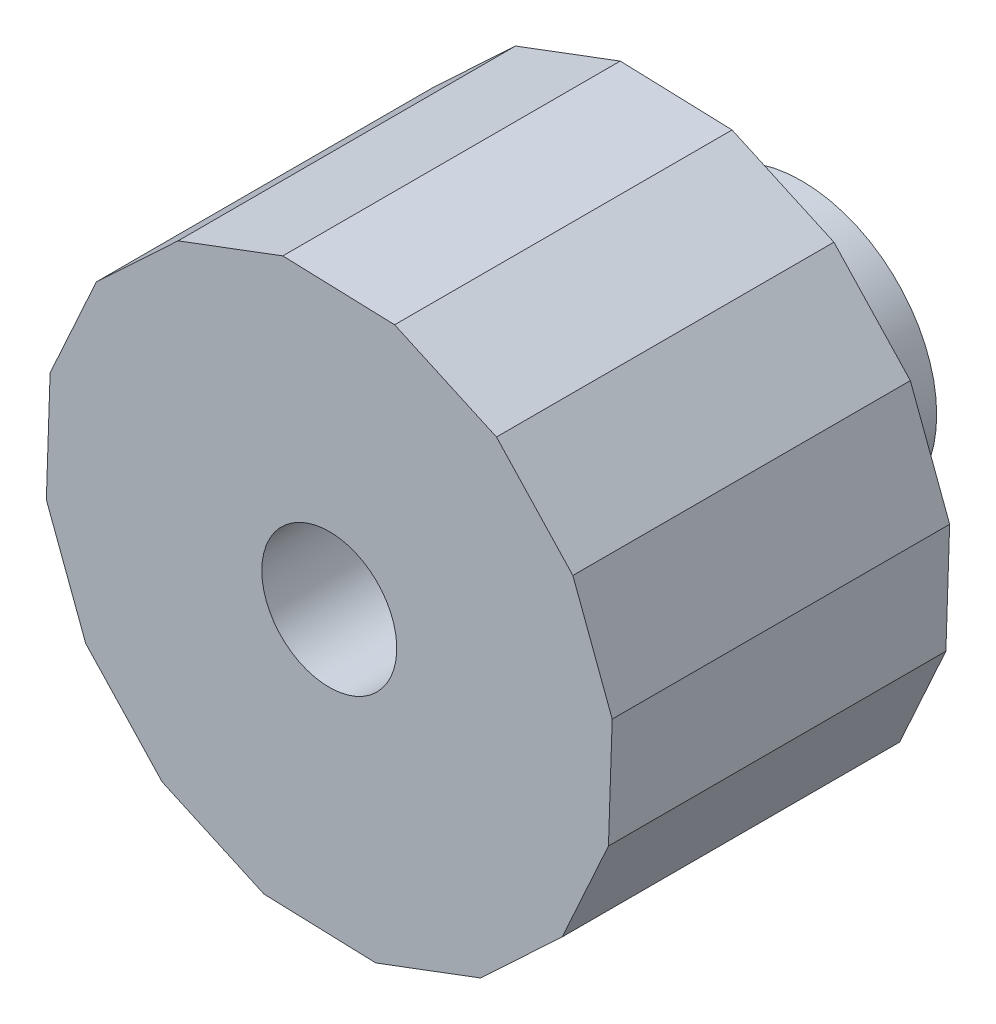
ISO-10303-21;
HEADER;
FILE_DESCRIPTION(('STEP AP214'),'2;1');
FILE_NAME('part.step','',(''),(''),'','','');
FILE_SCHEMA(('AUTOMOTIVE_DESIGN { 1 0 10303 214 1 1 1 1 }'));
ENDSEC;
DATA;
#1=APPLICATION_CONTEXT('core data for automotive mechanical design processes');
#2=APPLICATION_PROTOCOL_DEFINITION('international standard','automotive_design',2000,#1);
#3=PRODUCT_CONTEXT('',#1,'mechanical');
#4=PRODUCT('Part','Part','',(#3));
#5=PRODUCT_RELATED_PRODUCT_CATEGORY('part','',(#4));
#6=PRODUCT_DEFINITION_FORMATION('','',#4);
#7=PRODUCT_DEFINITION_CONTEXT('part definition',#1,'design');
#8=PRODUCT_DEFINITION('design','',#6,#7);
#9=PRODUCT_DEFINITION_SHAPE('','',#8);
#10=(LENGTH_UNIT() NAMED_UNIT(*) SI_UNIT(.MILLI.,.METRE.));
#11=(NAMED_UNIT(*) PLANE_ANGLE_UNIT() SI_UNIT($,.RADIAN.));
#12=(NAMED_UNIT(*) SI_UNIT($,.STERADIAN.) SOLID_ANGLE_UNIT());
#13=UNCERTAINTY_MEASURE_WITH_UNIT(LENGTH_MEASURE(1.E-05),#10,'distance_accuracy_value','');
#14=(GEOMETRIC_REPRESENTATION_CONTEXT(3) GLOBAL_UNCERTAINTY_ASSIGNED_CONTEXT((#13)) GLOBAL_UNIT_ASSIGNED_CONTEXT((#10,
#11,#12)) REPRESENTATION_CONTEXT('',''));
#15=CARTESIAN_POINT('',(0.,0.,0.));
#16=DIRECTION('',(0.,0.,1.));
#17=DIRECTION('',(1.,0.,0.));
#18=AXIS2_PLACEMENT_3D('',#15,#16,#17);
#19=CARTESIAN_POINT('',(0.,0.,0.));
#20=DIRECTION('',(0.,0.,1.));
#21=DIRECTION('',(1.,0.,0.));
#22=AXIS2_PLACEMENT_3D('',#19,#20,#21);
#23=PLANE('',#22);
#24=DIRECTION('',(-0.35147315864191,0.93619795917011,0.));
#25=VECTOR('',#24,1.);
#26=CARTESIAN_POINT('',(12.5763789653247,2.06564757809223,0.));
#27=LINE('',#26,#25);
#28=CARTESIAN_POINT('',(12.5763789653247,2.06564757809223,0.));
#29=VERTEX_POINT('',#28);
#30=CARTESIAN_POINT('',(10.828570013928,6.72118138795549,0.));
#31=VERTEX_POINT('',#30);
#32=EDGE_CURVE('E181',#29,#31,#27,.T.);
#33=ORIENTED_EDGE('',*,*,#32,.F.);
#34=DIRECTION('',(0.033548590892057,0.999437087589388,0.));
#35=VECTOR('',#34,1.);
#36=CARTESIAN_POINT('',(12.4095482244099,-2.90436235039365,0.));
#37=LINE('',#36,#35);
#38=CARTESIAN_POINT('',(12.4095482244099,-2.90436235039365,0.));
#39=VERTEX_POINT('',#38);
#40=EDGE_CURVE('E111',#39,#29,#37,.T.);
#41=ORIENTED_EDGE('',*,*,#40,.F.);
#42=DIRECTION('',(0.413462871581441,0.910520979342941,0.));
#43=VECTOR('',#42,1.);
#44=CARTESIAN_POINT('',(10.3534762591635,-7.43220943914236,0.));
#45=LINE('',#44,#43);
#46=CARTESIAN_POINT('',(10.3534762591635,-7.43220943914236,0.));
#47=VERTEX_POINT('',#46);
#48=EDGE_CURVE('E105',#47,#39,#45,.T.);
#49=ORIENTED_EDGE('',*,*,#48,.F.);
#50=DIRECTION('',(0.730431178122816,0.682986305884763,0.));
#51=VECTOR('',#50,1.);
#52=CARTESIAN_POINT('',(6.72118138795548,-10.828570013928,0.));
#53=LINE('',#52,#51);
#54=CARTESIAN_POINT('',(6.72118138795548,-10.828570013928,0.));
#55=VERTEX_POINT('',#54);
#56=EDGE_CURVE('E171',#55,#47,#53,.T.);
#57=ORIENTED_EDGE('',*,*,#56,.F.);
#58=DIRECTION('',(0.93619795917011,0.35147315864191,0.));
#59=VECTOR('',#58,1.);
#60=CARTESIAN_POINT('',(2.06564757809223,-12.5763789653247,0.));
#61=LINE('',#60,#59);
#62=CARTESIAN_POINT('',(2.06564757809223,-12.5763789653247,0.));
#63=VERTEX_POINT('',#62);
#64=EDGE_CURVE('E207',#63,#55,#61,.T.);
#65=ORIENTED_EDGE('',*,*,#64,.F.);
#66=DIRECTION('',(0.999437087589388,-0.0335485908920568,0.));
#67=VECTOR('',#66,1.);
#68=CARTESIAN_POINT('',(-2.90436235039363,-12.4095482244099,0.));
#69=LINE('',#68,#67);
#70=CARTESIAN_POINT('',(-2.90436235039363,-12.4095482244099,0.));
#71=VERTEX_POINT('',#70);
#72=EDGE_CURVE('E205',#71,#63,#69,.T.);
#73=ORIENTED_EDGE('',*,*,#72,.F.);
#74=DIRECTION('',(0.910520979342941,-0.413462871581442,0.));
#75=VECTOR('',#74,1.);
#76=CARTESIAN_POINT('',(-7.43220943914235,-10.3534762591635,0.));
#77=LINE('',#76,#75);
#78=CARTESIAN_POINT('',(-7.43220943914235,-10.3534762591635,0.));
#79=VERTEX_POINT('',#78);
#80=EDGE_CURVE('E203',#79,#71,#77,.T.);
#81=ORIENTED_EDGE('',*,*,#80,.F.);
#82=DIRECTION('',(0.682986305884763,-0.730431178122816,0.));
#83=VECTOR('',#82,1.);
#84=CARTESIAN_POINT('',(-10.828570013928,-6.72118138795548,0.));
#85=LINE('',#84,#83);
#86=CARTESIAN_POINT('',(-10.828570013928,-6.72118138795548,0.));
#87=VERTEX_POINT('',#86);
#88=EDGE_CURVE('E201',#87,#79,#85,.T.);
#89=ORIENTED_EDGE('',*,*,#88,.F.);
#90=DIRECTION('',(0.35147315864191,-0.93619795917011,0.));
#91=VECTOR('',#90,1.);
#92=CARTESIAN_POINT('',(-12.5763789653247,-2.06564757809222,0.));
#93=LINE('',#92,#91);
#94=CARTESIAN_POINT('',(-12.5763789653247,-2.06564757809222,0.));
#95=VERTEX_POINT('',#94);
#96=EDGE_CURVE('E199',#95,#87,#93,.T.);
#97=ORIENTED_EDGE('',*,*,#96,.F.);
#98=DIRECTION('',(-0.033548590892057,-0.999437087589388,0.));
#99=VECTOR('',#98,1.);
#100=CARTESIAN_POINT('',(-12.4095482244099,2.90436235039365,0.));
#101=LINE('',#100,#99);
#102=CARTESIAN_POINT('',(-12.4095482244099,2.90436235039365,0.));
#103=VERTEX_POINT('',#102);
#104=EDGE_CURVE('E197',#103,#95,#101,.T.);
#105=ORIENTED_EDGE('',*,*,#104,.F.);
#106=DIRECTION('',(-0.413462871581441,-0.910520979342941,0.));
#107=VECTOR('',#106,1.);
#108=CARTESIAN_POINT('',(-10.3534762591635,7.43220943914235,0.));
#109=LINE('',#108,#107);
#110=CARTESIAN_POINT('',(-10.3534762591635,7.43220943914235,0.));
#111=VERTEX_POINT('',#110);
#112=EDGE_CURVE('E195',#111,#103,#109,.T.);
#113=ORIENTED_EDGE('',*,*,#112,.F.);
#114=DIRECTION('',(-0.730431178122816,-0.682986305884763,0.));
#115=VECTOR('',#114,1.);
#116=CARTESIAN_POINT('',(-6.72118138795549,10.828570013928,0.));
#117=LINE('',#116,#115);
#118=CARTESIAN_POINT('',(-6.72118138795549,10.828570013928,0.));
#119=VERTEX_POINT('',#118);
#120=EDGE_CURVE('E193',#119,#111,#117,.T.);
#121=ORIENTED_EDGE('',*,*,#120,.F.);
#122=DIRECTION('',(-0.93619795917011,-0.35147315864191,0.));
#123=VECTOR('',#122,1.);
#124=CARTESIAN_POINT('',(-2.06564757809223,12.5763789653247,0.));
#125=LINE('',#124,#123);
#126=CARTESIAN_POINT('',(-2.06564757809223,12.5763789653247,0.));
#127=VERTEX_POINT('',#126);
#128=EDGE_CURVE('E191',#127,#119,#125,.T.);
#129=ORIENTED_EDGE('',*,*,#128,.F.);
#130=DIRECTION('',(-0.999437087589388,0.0335485908920563,0.));
#131=VECTOR('',#130,1.);
#132=CARTESIAN_POINT('',(2.90436235039365,12.4095482244099,0.));
#133=LINE('',#132,#131);
#134=CARTESIAN_POINT('',(2.90436235039365,12.4095482244099,0.));
#135=VERTEX_POINT('',#134);
#136=EDGE_CURVE('E189',#135,#127,#133,.T.);
#137=ORIENTED_EDGE('',*,*,#136,.F.);
#138=DIRECTION('',(-0.910520979342941,0.413462871581442,0.));
#139=VECTOR('',#138,1.);
#140=CARTESIAN_POINT('',(7.43220943914235,10.3534762591635,0.));
#141=LINE('',#140,#139);
#142=CARTESIAN_POINT('',(7.43220943914235,10.3534762591635,0.));
#143=VERTEX_POINT('',#142);
#144=EDGE_CURVE('E187',#143,#135,#141,.T.);
#145=ORIENTED_EDGE('',*,*,#144,.F.);
#146=DIRECTION('',(-0.682986305884763,0.730431178122816,0.));
#147=VECTOR('',#146,1.);
#148=CARTESIAN_POINT('',(10.828570013928,6.72118138795549,0.));
#149=LINE('',#148,#147);
#150=EDGE_CURVE('E184',#31,#143,#149,.T.);
#151=ORIENTED_EDGE('',*,*,#150,.F.);
#152=EDGE_LOOP('',(#33,#41,#49,#57,#65,#73,#81,#89,#97,#105,#113,#121,#129,#137,#145,#151));
#153=FACE_BOUND('',#152,.T.);
#154=CARTESIAN_POINT('',(0.,0.,0.));
#155=DIRECTION('',(0.,0.,1.));
#156=DIRECTION('',(1.,0.,0.));
#157=AXIS2_PLACEMENT_3D('',#154,#155,#156);
#158=CIRCLE('',#157,6.);
#159=CARTESIAN_POINT('',(6.,0.,0.));
#160=VERTEX_POINT('',#159);
#161=EDGE_CURVE('E11',#160,#160,#158,.F.);
#162=ORIENTED_EDGE('',*,*,#161,.F.);
#163=EDGE_LOOP('',(#162));
#164=FACE_BOUND('',#163,.T.);
#165=ADVANCED_FACE('F35',(#153,#164),#23,.F.);
#166=CARTESIAN_POINT('',(12.5763789653247,2.06564757809223,15.));
#167=DIRECTION('',(-0.93619795917011,-0.35147315864191,0.));
#168=DIRECTION('',(0.35147315864191,-0.93619795917011,0.));
#169=AXIS2_PLACEMENT_3D('',#166,#167,#168);
#170=PLANE('',#169);
#171=ORIENTED_EDGE('',*,*,#32,.T.);
#172=DIRECTION('',(0.,0.,-1.));
#173=VECTOR('',#172,1.);
#174=CARTESIAN_POINT('',(10.828570013928,6.72118138795549,15.));
#175=LINE('',#174,#173);
#176=CARTESIAN_POINT('',(10.828570013928,6.72118138795549,15.));
#177=VERTEX_POINT('',#176);
#178=EDGE_CURVE('E44',#177,#31,#175,.T.);
#179=ORIENTED_EDGE('',*,*,#178,.F.);
#180=DIRECTION('',(-0.35147315864191,0.93619795917011,0.));
#181=VECTOR('',#180,1.);
#182=CARTESIAN_POINT('',(12.5763789653247,2.06564757809223,15.));
#183=LINE('',#182,#181);
#184=CARTESIAN_POINT('',(12.5763789653247,2.06564757809223,15.));
#185=VERTEX_POINT('',#184);
#186=EDGE_CURVE('E212',#185,#177,#183,.T.);
#187=ORIENTED_EDGE('',*,*,#186,.F.);
#188=DIRECTION('',(0.,0.,-1.));
#189=VECTOR('',#188,1.);
#190=CARTESIAN_POINT('',(12.5763789653247,2.06564757809223,15.));
#191=LINE('',#190,#189);
#192=EDGE_CURVE('E177',#185,#29,#191,.T.);
#193=ORIENTED_EDGE('',*,*,#192,.T.);
#194=EDGE_LOOP('',(#171,#179,#187,#193));
#195=FACE_BOUND('',#194,.T.);
#196=ADVANCED_FACE('F37',(#195),#170,.F.);
#197=CARTESIAN_POINT('',(10.828570013928,6.72118138795549,15.));
#198=DIRECTION('',(-0.730431178122816,-0.682986305884763,0.));
#199=DIRECTION('',(0.682986305884763,-0.730431178122816,0.));
#200=AXIS2_PLACEMENT_3D('',#197,#198,#199);
#201=PLANE('',#200);
#202=ORIENTED_EDGE('',*,*,#150,.T.);
#203=DIRECTION('',(0.,0.,-1.));
#204=VECTOR('',#203,1.);
#205=CARTESIAN_POINT('',(7.43220943914235,10.3534762591635,15.));
#206=LINE('',#205,#204);
#207=CARTESIAN_POINT('',(7.43220943914235,10.3534762591635,15.));
#208=VERTEX_POINT('',#207);
#209=EDGE_CURVE('E246',#208,#143,#206,.T.);
#210=ORIENTED_EDGE('',*,*,#209,.F.);
#211=DIRECTION('',(-0.682986305884763,0.730431178122816,0.));
#212=VECTOR('',#211,1.);
#213=CARTESIAN_POINT('',(10.828570013928,6.72118138795549,15.));
#214=LINE('',#213,#212);
#215=EDGE_CURVE('E120',#177,#208,#214,.T.);
#216=ORIENTED_EDGE('',*,*,#215,.F.);
#217=ORIENTED_EDGE('',*,*,#178,.T.);
#218=EDGE_LOOP('',(#202,#210,#216,#217));
#219=FACE_BOUND('',#218,.T.);
#220=ADVANCED_FACE('F249',(#219),#201,.F.);
#221=CARTESIAN_POINT('',(7.43220943914235,10.3534762591635,15.));
#222=DIRECTION('',(-0.413462871581442,-0.910520979342941,0.));
#223=DIRECTION('',(0.910520979342941,-0.413462871581442,0.));
#224=AXIS2_PLACEMENT_3D('',#221,#222,#223);
#225=PLANE('',#224);
#226=ORIENTED_EDGE('',*,*,#144,.T.);
#227=DIRECTION('',(0.,0.,-1.));
#228=VECTOR('',#227,1.);
#229=CARTESIAN_POINT('',(2.90436235039365,12.4095482244099,15.));
#230=LINE('',#229,#228);
#231=CARTESIAN_POINT('',(2.90436235039365,12.4095482244099,15.));
#232=VERTEX_POINT('',#231);
#233=EDGE_CURVE('E243',#232,#135,#230,.T.);
#234=ORIENTED_EDGE('',*,*,#233,.F.);
#235=DIRECTION('',(-0.910520979342941,0.413462871581442,0.));
#236=VECTOR('',#235,1.);
#237=CARTESIAN_POINT('',(7.43220943914235,10.3534762591635,15.));
#238=LINE('',#237,#236);
#239=EDGE_CURVE('E269',#208,#232,#238,.T.);
#240=ORIENTED_EDGE('',*,*,#239,.F.);
#241=ORIENTED_EDGE('',*,*,#209,.T.);
#242=EDGE_LOOP('',(#226,#234,#240,#241));
#243=FACE_BOUND('',#242,.T.);
#244=ADVANCED_FACE('F260',(#243),#225,.F.);
#245=CARTESIAN_POINT('',(2.90436235039365,12.4095482244099,15.));
#246=DIRECTION('',(-0.0335485908920563,-0.999437087589388,0.));
#247=DIRECTION('',(0.999437087589388,-0.0335485908920563,0.));
#248=AXIS2_PLACEMENT_3D('',#245,#246,#247);
#249=PLANE('',#248);
#250=ORIENTED_EDGE('',*,*,#136,.T.);
#251=DIRECTION('',(0.,0.,-1.));
#252=VECTOR('',#251,1.);
#253=CARTESIAN_POINT('',(-2.06564757809223,12.5763789653247,15.));
#254=LINE('',#253,#252);
#255=CARTESIAN_POINT('',(-2.06564757809223,12.5763789653247,15.));
#256=VERTEX_POINT('',#255);
#257=EDGE_CURVE('E240',#256,#127,#254,.T.);
#258=ORIENTED_EDGE('',*,*,#257,.F.);
#259=DIRECTION('',(-0.999437087589388,0.0335485908920563,0.));
#260=VECTOR('',#259,1.);
#261=CARTESIAN_POINT('',(2.90436235039365,12.4095482244099,15.));
#262=LINE('',#261,#260);
#263=EDGE_CURVE('E266',#232,#256,#262,.T.);
#264=ORIENTED_EDGE('',*,*,#263,.F.);
#265=ORIENTED_EDGE('',*,*,#233,.T.);
#266=EDGE_LOOP('',(#250,#258,#264,#265));
#267=FACE_BOUND('',#266,.T.);
#268=ADVANCED_FACE('F264',(#267),#249,.F.);
#269=CARTESIAN_POINT('',(-2.06564757809223,12.5763789653247,15.));
#270=DIRECTION('',(0.35147315864191,-0.93619795917011,0.));
#271=DIRECTION('',(0.93619795917011,0.35147315864191,0.));
#272=AXIS2_PLACEMENT_3D('',#269,#270,#271);
#273=PLANE('',#272);
#274=ORIENTED_EDGE('',*,*,#128,.T.);
#275=DIRECTION('',(0.,0.,-1.));
#276=VECTOR('',#275,1.);
#277=CARTESIAN_POINT('',(-6.72118138795549,10.828570013928,15.));
#278=LINE('',#277,#276);
#279=CARTESIAN_POINT('',(-6.72118138795549,10.828570013928,15.));
#280=VERTEX_POINT('',#279);
#281=EDGE_CURVE('E237',#280,#119,#278,.T.);
#282=ORIENTED_EDGE('',*,*,#281,.F.);
#283=DIRECTION('',(-0.93619795917011,-0.35147315864191,0.));
#284=VECTOR('',#283,1.);
#285=CARTESIAN_POINT('',(-2.06564757809223,12.5763789653247,15.));
#286=LINE('',#285,#284);
#287=EDGE_CURVE('E268',#256,#280,#286,.T.);
#288=ORIENTED_EDGE('',*,*,#287,.F.);
#289=ORIENTED_EDGE('',*,*,#257,.T.);
#290=EDGE_LOOP('',(#274,#282,#288,#289));
#291=FACE_BOUND('',#290,.T.);
#292=ADVANCED_FACE('F328',(#291),#273,.F.);
#293=CARTESIAN_POINT('',(-6.72118138795549,10.828570013928,15.));
#294=DIRECTION('',(0.682986305884763,-0.730431178122816,0.));
#295=DIRECTION('',(0.730431178122816,0.682986305884763,0.));
#296=AXIS2_PLACEMENT_3D('',#293,#294,#295);
#297=PLANE('',#296);
#298=ORIENTED_EDGE('',*,*,#120,.T.);
#299=DIRECTION('',(0.,0.,-1.));
#300=VECTOR('',#299,1.);
#301=CARTESIAN_POINT('',(-10.3534762591635,7.43220943914235,15.));
#302=LINE('',#301,#300);
#303=CARTESIAN_POINT('',(-10.3534762591635,7.43220943914235,15.));
#304=VERTEX_POINT('',#303);
#305=EDGE_CURVE('E234',#304,#111,#302,.T.);
#306=ORIENTED_EDGE('',*,*,#305,.F.);
#307=DIRECTION('',(-0.730431178122816,-0.682986305884763,0.));
#308=VECTOR('',#307,1.);
#309=CARTESIAN_POINT('',(-6.72118138795549,10.828570013928,15.));
#310=LINE('',#309,#308);
#311=EDGE_CURVE('E271',#280,#304,#310,.T.);
#312=ORIENTED_EDGE('',*,*,#311,.F.);
#313=ORIENTED_EDGE('',*,*,#281,.T.);
#314=EDGE_LOOP('',(#298,#306,#312,#313));
#315=FACE_BOUND('',#314,.T.);
#316=ADVANCED_FACE('F325',(#315),#297,.F.);
#317=CARTESIAN_POINT('',(-10.3534762591635,7.43220943914235,15.));
#318=DIRECTION('',(0.910520979342941,-0.413462871581441,0.));
#319=DIRECTION('',(0.413462871581441,0.910520979342941,0.));
#320=AXIS2_PLACEMENT_3D('',#317,#318,#319);
#321=PLANE('',#320);
#322=ORIENTED_EDGE('',*,*,#112,.T.);
#323=DIRECTION('',(0.,0.,-1.));
#324=VECTOR('',#323,1.);
#325=CARTESIAN_POINT('',(-12.4095482244099,2.90436235039365,15.));
#326=LINE('',#325,#324);
#327=CARTESIAN_POINT('',(-12.4095482244099,2.90436235039365,15.));
#328=VERTEX_POINT('',#327);
#329=EDGE_CURVE('E231',#328,#103,#326,.T.);
#330=ORIENTED_EDGE('',*,*,#329,.F.);
#331=DIRECTION('',(-0.413462871581441,-0.910520979342941,0.));
#332=VECTOR('',#331,1.);
#333=CARTESIAN_POINT('',(-10.3534762591635,7.43220943914235,15.));
#334=LINE('',#333,#332);
#335=EDGE_CURVE('E277',#304,#328,#334,.T.);
#336=ORIENTED_EDGE('',*,*,#335,.F.);
#337=ORIENTED_EDGE('',*,*,#305,.T.);
#338=EDGE_LOOP('',(#322,#330,#336,#337));
#339=FACE_BOUND('',#338,.T.);
#340=ADVANCED_FACE('F321',(#339),#321,.F.);
#341=CARTESIAN_POINT('',(-12.4095482244099,2.90436235039365,15.));
#342=DIRECTION('',(0.999437087589388,-0.033548590892057,0.));
#343=DIRECTION('',(0.033548590892057,0.999437087589388,0.));
#344=AXIS2_PLACEMENT_3D('',#341,#342,#343);
#345=PLANE('',#344);
#346=ORIENTED_EDGE('',*,*,#104,.T.);
#347=DIRECTION('',(0.,0.,-1.));
#348=VECTOR('',#347,1.);
#349=CARTESIAN_POINT('',(-12.5763789653247,-2.06564757809222,15.));
#350=LINE('',#349,#348);
#351=CARTESIAN_POINT('',(-12.5763789653247,-2.06564757809222,15.));
#352=VERTEX_POINT('',#351);
#353=EDGE_CURVE('E228',#352,#95,#350,.T.);
#354=ORIENTED_EDGE('',*,*,#353,.F.);
#355=DIRECTION('',(-0.033548590892057,-0.999437087589388,0.));
#356=VECTOR('',#355,1.);
#357=CARTESIAN_POINT('',(-12.4095482244099,2.90436235039365,15.));
#358=LINE('',#357,#356);
#359=EDGE_CURVE('E279',#328,#352,#358,.T.);
#360=ORIENTED_EDGE('',*,*,#359,.F.);
#361=ORIENTED_EDGE('',*,*,#329,.T.);
#362=EDGE_LOOP('',(#346,#354,#360,#361));
#363=FACE_BOUND('',#362,.T.);
#364=ADVANCED_FACE('F316',(#363),#345,.F.);
#365=CARTESIAN_POINT('',(-12.5763789653247,-2.06564757809222,15.));
#366=DIRECTION('',(0.93619795917011,0.35147315864191,0.));
#367=DIRECTION('',(-0.35147315864191,0.93619795917011,0.));
#368=AXIS2_PLACEMENT_3D('',#365,#366,#367);
#369=PLANE('',#368);
#370=ORIENTED_EDGE('',*,*,#96,.T.);
#371=DIRECTION('',(0.,0.,-1.));
#372=VECTOR('',#371,1.);
#373=CARTESIAN_POINT('',(-10.828570013928,-6.72118138795548,15.));
#374=LINE('',#373,#372);
#375=CARTESIAN_POINT('',(-10.828570013928,-6.72118138795548,15.));
#376=VERTEX_POINT('',#375);
#377=EDGE_CURVE('E225',#376,#87,#374,.T.);
#378=ORIENTED_EDGE('',*,*,#377,.F.);
#379=DIRECTION('',(0.35147315864191,-0.93619795917011,0.));
#380=VECTOR('',#379,1.);
#381=CARTESIAN_POINT('',(-12.5763789653247,-2.06564757809222,15.));
#382=LINE('',#381,#380);
#383=EDGE_CURVE('E281',#352,#376,#382,.T.);
#384=ORIENTED_EDGE('',*,*,#383,.F.);
#385=ORIENTED_EDGE('',*,*,#353,.T.);
#386=EDGE_LOOP('',(#370,#378,#384,#385));
#387=FACE_BOUND('',#386,.T.);
#388=ADVANCED_FACE('F310',(#387),#369,.F.);
#389=CARTESIAN_POINT('',(-10.828570013928,-6.72118138795548,15.));
#390=DIRECTION('',(0.730431178122816,0.682986305884763,0.));
#391=DIRECTION('',(-0.682986305884763,0.730431178122816,0.));
#392=AXIS2_PLACEMENT_3D('',#389,#390,#391);
#393=PLANE('',#392);
#394=ORIENTED_EDGE('',*,*,#88,.T.);
#395=DIRECTION('',(0.,0.,-1.));
#396=VECTOR('',#395,1.);
#397=CARTESIAN_POINT('',(-7.43220943914235,-10.3534762591635,15.));
#398=LINE('',#397,#396);
#399=CARTESIAN_POINT('',(-7.43220943914235,-10.3534762591635,15.));
#400=VERTEX_POINT('',#399);
#401=EDGE_CURVE('E222',#400,#79,#398,.T.);
#402=ORIENTED_EDGE('',*,*,#401,.F.);
#403=DIRECTION('',(0.682986305884763,-0.730431178122816,0.));
#404=VECTOR('',#403,1.);
#405=CARTESIAN_POINT('',(-10.828570013928,-6.72118138795548,15.));
#406=LINE('',#405,#404);
#407=EDGE_CURVE('E283',#376,#400,#406,.T.);
#408=ORIENTED_EDGE('',*,*,#407,.F.);
#409=ORIENTED_EDGE('',*,*,#377,.T.);
#410=EDGE_LOOP('',(#394,#402,#408,#409));
#411=FACE_BOUND('',#410,.T.);
#412=ADVANCED_FACE('F306',(#411),#393,.F.);
#413=CARTESIAN_POINT('',(-7.43220943914235,-10.3534762591635,15.));
#414=DIRECTION('',(0.413462871581442,0.910520979342941,0.));
#415=DIRECTION('',(-0.910520979342941,0.413462871581442,0.));
#416=AXIS2_PLACEMENT_3D('',#413,#414,#415);
#417=PLANE('',#416);
#418=ORIENTED_EDGE('',*,*,#80,.T.);
#419=DIRECTION('',(0.,0.,-1.));
#420=VECTOR('',#419,1.);
#421=CARTESIAN_POINT('',(-2.90436235039363,-12.4095482244099,15.));
#422=LINE('',#421,#420);
#423=CARTESIAN_POINT('',(-2.90436235039363,-12.4095482244099,15.));
#424=VERTEX_POINT('',#423);
#425=EDGE_CURVE('E219',#424,#71,#422,.T.);
#426=ORIENTED_EDGE('',*,*,#425,.F.);
#427=DIRECTION('',(0.910520979342941,-0.413462871581442,0.));
#428=VECTOR('',#427,1.);
#429=CARTESIAN_POINT('',(-7.43220943914235,-10.3534762591635,15.));
#430=LINE('',#429,#428);
#431=EDGE_CURVE('E285',#400,#424,#430,.T.);
#432=ORIENTED_EDGE('',*,*,#431,.F.);
#433=ORIENTED_EDGE('',*,*,#401,.T.);
#434=EDGE_LOOP('',(#418,#426,#432,#433));
#435=FACE_BOUND('',#434,.T.);
#436=ADVANCED_FACE('F302',(#435),#417,.F.);
#437=CARTESIAN_POINT('',(-2.90436235039363,-12.4095482244099,15.));
#438=DIRECTION('',(0.0335485908920568,0.999437087589388,0.));
#439=DIRECTION('',(-0.999437087589388,0.0335485908920568,0.));
#440=AXIS2_PLACEMENT_3D('',#437,#438,#439);
#441=PLANE('',#440);
#442=ORIENTED_EDGE('',*,*,#72,.T.);
#443=DIRECTION('',(0.,0.,-1.));
#444=VECTOR('',#443,1.);
#445=CARTESIAN_POINT('',(2.06564757809223,-12.5763789653247,15.));
#446=LINE('',#445,#444);
#447=CARTESIAN_POINT('',(2.06564757809223,-12.5763789653247,15.));
#448=VERTEX_POINT('',#447);
#449=EDGE_CURVE('E216',#448,#63,#446,.T.);
#450=ORIENTED_EDGE('',*,*,#449,.F.);
#451=DIRECTION('',(0.999437087589388,-0.0335485908920568,0.));
#452=VECTOR('',#451,1.);
#453=CARTESIAN_POINT('',(-2.90436235039363,-12.4095482244099,15.));
#454=LINE('',#453,#452);
#455=EDGE_CURVE('E287',#424,#448,#454,.T.);
#456=ORIENTED_EDGE('',*,*,#455,.F.);
#457=ORIENTED_EDGE('',*,*,#425,.T.);
#458=EDGE_LOOP('',(#442,#450,#456,#457));
#459=FACE_BOUND('',#458,.T.);
#460=ADVANCED_FACE('F293',(#459),#441,.F.);
#461=CARTESIAN_POINT('',(2.06564757809223,-12.5763789653247,15.));
#462=DIRECTION('',(-0.35147315864191,0.93619795917011,0.));
#463=DIRECTION('',(-0.93619795917011,-0.35147315864191,0.));
#464=AXIS2_PLACEMENT_3D('',#461,#462,#463);
#465=PLANE('',#464);
#466=ORIENTED_EDGE('',*,*,#64,.T.);
#467=DIRECTION('',(0.,0.,-1.));
#468=VECTOR('',#467,1.);
#469=CARTESIAN_POINT('',(6.72118138795548,-10.828570013928,15.));
#470=LINE('',#469,#468);
#471=CARTESIAN_POINT('',(6.72118138795548,-10.828570013928,15.));
#472=VERTEX_POINT('',#471);
#473=EDGE_CURVE('E172',#472,#55,#470,.T.);
#474=ORIENTED_EDGE('',*,*,#473,.F.);
#475=DIRECTION('',(0.93619795917011,0.35147315864191,0.));
#476=VECTOR('',#475,1.);
#477=CARTESIAN_POINT('',(2.06564757809223,-12.5763789653247,15.));
#478=LINE('',#477,#476);
#479=EDGE_CURVE('E163',#448,#472,#478,.T.);
#480=ORIENTED_EDGE('',*,*,#479,.F.);
#481=ORIENTED_EDGE('',*,*,#449,.T.);
#482=EDGE_LOOP('',(#466,#474,#480,#481));
#483=FACE_BOUND('',#482,.T.);
#484=ADVANCED_FACE('F297',(#483),#465,.F.);
#485=CARTESIAN_POINT('',(6.72118138795548,-10.828570013928,15.));
#486=DIRECTION('',(-0.682986305884763,0.730431178122816,0.));
#487=DIRECTION('',(-0.730431178122816,-0.682986305884763,0.));
#488=AXIS2_PLACEMENT_3D('',#485,#486,#487);
#489=PLANE('',#488);
#490=ORIENTED_EDGE('',*,*,#56,.T.);
#491=DIRECTION('',(0.,0.,-1.));
#492=VECTOR('',#491,1.);
#493=CARTESIAN_POINT('',(10.3534762591635,-7.43220943914236,15.));
#494=LINE('',#493,#492);
#495=CARTESIAN_POINT('',(10.3534762591635,-7.43220943914236,15.));
#496=VERTEX_POINT('',#495);
#497=EDGE_CURVE('E168',#496,#47,#494,.T.);
#498=ORIENTED_EDGE('',*,*,#497,.F.);
#499=DIRECTION('',(0.730431178122816,0.682986305884763,0.));
#500=VECTOR('',#499,1.);
#501=CARTESIAN_POINT('',(6.72118138795548,-10.828570013928,15.));
#502=LINE('',#501,#500);
#503=EDGE_CURVE('E157',#472,#496,#502,.T.);
#504=ORIENTED_EDGE('',*,*,#503,.F.);
#505=ORIENTED_EDGE('',*,*,#473,.T.);
#506=EDGE_LOOP('',(#490,#498,#504,#505));
#507=FACE_BOUND('',#506,.T.);
#508=ADVANCED_FACE('F169',(#507),#489,.F.);
#509=CARTESIAN_POINT('',(10.3534762591635,-7.43220943914236,15.));
#510=DIRECTION('',(-0.910520979342941,0.413462871581441,0.));
#511=DIRECTION('',(-0.413462871581441,-0.910520979342941,0.));
#512=AXIS2_PLACEMENT_3D('',#509,#510,#511);
#513=PLANE('',#512);
#514=ORIENTED_EDGE('',*,*,#48,.T.);
#515=DIRECTION('',(0.,0.,-1.));
#516=VECTOR('',#515,1.);
#517=CARTESIAN_POINT('',(12.4095482244099,-2.90436235039365,15.));
#518=LINE('',#517,#516);
#519=CARTESIAN_POINT('',(12.4095482244099,-2.90436235039365,15.));
#520=VERTEX_POINT('',#519);
#521=EDGE_CURVE('E173',#520,#39,#518,.T.);
#522=ORIENTED_EDGE('',*,*,#521,.F.);
#523=DIRECTION('',(0.413462871581441,0.910520979342941,0.));
#524=VECTOR('',#523,1.);
#525=CARTESIAN_POINT('',(10.3534762591635,-7.43220943914236,15.));
#526=LINE('',#525,#524);
#527=EDGE_CURVE('E161',#496,#520,#526,.T.);
#528=ORIENTED_EDGE('',*,*,#527,.F.);
#529=ORIENTED_EDGE('',*,*,#497,.T.);
#530=EDGE_LOOP('',(#514,#522,#528,#529));
#531=FACE_BOUND('',#530,.T.);
#532=ADVANCED_FACE('F175',(#531),#513,.F.);
#533=CARTESIAN_POINT('',(12.4095482244099,-2.90436235039365,15.));
#534=DIRECTION('',(-0.999437087589388,0.033548590892057,0.));
#535=DIRECTION('',(-0.033548590892057,-0.999437087589388,0.));
#536=AXIS2_PLACEMENT_3D('',#533,#534,#535);
#537=PLANE('',#536);
#538=ORIENTED_EDGE('',*,*,#40,.T.);
#539=ORIENTED_EDGE('',*,*,#192,.F.);
#540=DIRECTION('',(0.033548590892057,0.999437087589388,0.));
#541=VECTOR('',#540,1.);
#542=CARTESIAN_POINT('',(12.4095482244099,-2.90436235039365,15.));
#543=LINE('',#542,#541);
#544=EDGE_CURVE('E52',#520,#185,#543,.T.);
#545=ORIENTED_EDGE('',*,*,#544,.F.);
#546=ORIENTED_EDGE('',*,*,#521,.T.);
#547=EDGE_LOOP('',(#538,#539,#545,#546));
#548=FACE_BOUND('',#547,.T.);
#549=ADVANCED_FACE('F345',(#548),#537,.F.);
#550=CARTESIAN_POINT('',(0.,0.,15.));
#551=DIRECTION('',(0.,0.,1.));
#552=DIRECTION('',(1.,0.,0.));
#553=AXIS2_PLACEMENT_3D('',#550,#551,#552);
#554=PLANE('',#553);
#555=CARTESIAN_POINT('',(0.,0.,15.));
#556=DIRECTION('',(0.,0.,-1.));
#557=DIRECTION('',(-1.,0.,0.));
#558=AXIS2_PLACEMENT_3D('',#555,#556,#557);
#559=CIRCLE('',#558,3.);
#560=CARTESIAN_POINT('',(-3.,0.,15.));
#561=VERTEX_POINT('',#560);
#562=EDGE_CURVE('E506',#561,#561,#559,.T.);
#563=ORIENTED_EDGE('',*,*,#562,.T.);
#564=EDGE_LOOP('',(#563));
#565=FACE_BOUND('',#564,.T.);
#566=ORIENTED_EDGE('',*,*,#186,.T.);
#567=ORIENTED_EDGE('',*,*,#215,.T.);
#568=ORIENTED_EDGE('',*,*,#239,.T.);
#569=ORIENTED_EDGE('',*,*,#263,.T.);
#570=ORIENTED_EDGE('',*,*,#287,.T.);
#571=ORIENTED_EDGE('',*,*,#311,.T.);
#572=ORIENTED_EDGE('',*,*,#335,.T.);
#573=ORIENTED_EDGE('',*,*,#359,.T.);
#574=ORIENTED_EDGE('',*,*,#383,.T.);
#575=ORIENTED_EDGE('',*,*,#407,.T.);
#576=ORIENTED_EDGE('',*,*,#431,.T.);
#577=ORIENTED_EDGE('',*,*,#455,.T.);
#578=ORIENTED_EDGE('',*,*,#479,.T.);
#579=ORIENTED_EDGE('',*,*,#503,.T.);
#580=ORIENTED_EDGE('',*,*,#527,.T.);
#581=ORIENTED_EDGE('',*,*,#544,.T.);
#582=EDGE_LOOP('',(#566,#567,#568,#569,#570,#571,#572,#573,#574,#575,#576,#577,#578,#579,#580,#581));
#583=FACE_BOUND('',#582,.T.);
#584=ADVANCED_FACE('F159',(#565,#583),#554,.T.);
#585=CARTESIAN_POINT('',(0.,0.,-6.));
#586=DIRECTION('',(0.,0.,1.));
#587=DIRECTION('',(1.,0.,0.));
#588=AXIS2_PLACEMENT_3D('',#585,#586,#587);
#589=CYLINDRICAL_SURFACE('',#588,6.);
#590=CARTESIAN_POINT('',(0.,0.,-6.));
#591=DIRECTION('',(0.,0.,-1.));
#592=DIRECTION('',(-1.,0.,0.));
#593=AXIS2_PLACEMENT_3D('',#590,#591,#592);
#594=CIRCLE('',#593,6.);
#595=CARTESIAN_POINT('',(-6.,0.,-6.));
#596=VERTEX_POINT('',#595);
#597=EDGE_CURVE('E185',#596,#596,#594,.T.);
#598=ORIENTED_EDGE('',*,*,#597,.F.);
#599=EDGE_LOOP('',(#598));
#600=FACE_BOUND('',#599,.T.);
#601=ORIENTED_EDGE('',*,*,#161,.T.);
#602=EDGE_LOOP('',(#601));
#603=FACE_BOUND('',#602,.T.);
#604=ADVANCED_FACE('F411',(#600,#603),#589,.T.);
#605=CARTESIAN_POINT('',(0.,0.,-6.));
#606=DIRECTION('',(0.,0.,-1.));
#607=DIRECTION('',(-1.,0.,0.));
#608=AXIS2_PLACEMENT_3D('',#605,#606,#607);
#609=PLANE('',#608);
#610=CARTESIAN_POINT('',(0.,0.,-6.));
#611=DIRECTION('',(0.,0.,-1.));
#612=DIRECTION('',(-1.,0.,0.));
#613=AXIS2_PLACEMENT_3D('',#610,#611,#612);
#614=CIRCLE('',#613,3.);
#615=CARTESIAN_POINT('',(-3.,0.,-6.));
#616=VERTEX_POINT('',#615);
#617=EDGE_CURVE('E509',#616,#616,#614,.T.);
#618=ORIENTED_EDGE('',*,*,#617,.F.);
#619=EDGE_LOOP('',(#618));
#620=FACE_BOUND('',#619,.T.);
#621=ORIENTED_EDGE('',*,*,#597,.T.);
#622=EDGE_LOOP('',(#621));
#623=FACE_BOUND('',#622,.T.);
#624=ADVANCED_FACE('F419',(#620,#623),#609,.T.);
#625=CARTESIAN_POINT('',(0.,0.,15.));
#626=DIRECTION('',(0.,0.,-1.));
#627=DIRECTION('',(-1.,0.,0.));
#628=AXIS2_PLACEMENT_3D('',#625,#626,#627);
#629=CYLINDRICAL_SURFACE('',#628,3.);
#630=ORIENTED_EDGE('',*,*,#562,.F.);
#631=EDGE_LOOP('',(#630));
#632=FACE_BOUND('',#631,.T.);
#633=ORIENTED_EDGE('',*,*,#617,.T.);
#634=EDGE_LOOP('',(#633));
#635=FACE_BOUND('',#634,.T.);
#636=ADVANCED_FACE('F425',(#632,#635),#629,.F.);
#637=CLOSED_SHELL('',(#165,#196,#220,#244,#268,#292,#316,#340,#364,#388,#412,#436,#460,#484,
#508,#532,#549,#584,#604,#624,#636));
#638=MANIFOLD_SOLID_BREP('B2',#637);
#639=ADVANCED_BREP_SHAPE_REPRESENTATION('',(#18,#638),#14);
#640=SHAPE_DEFINITION_REPRESENTATION(#9,#639);
ENDSEC;
END-ISO-10303-21;
